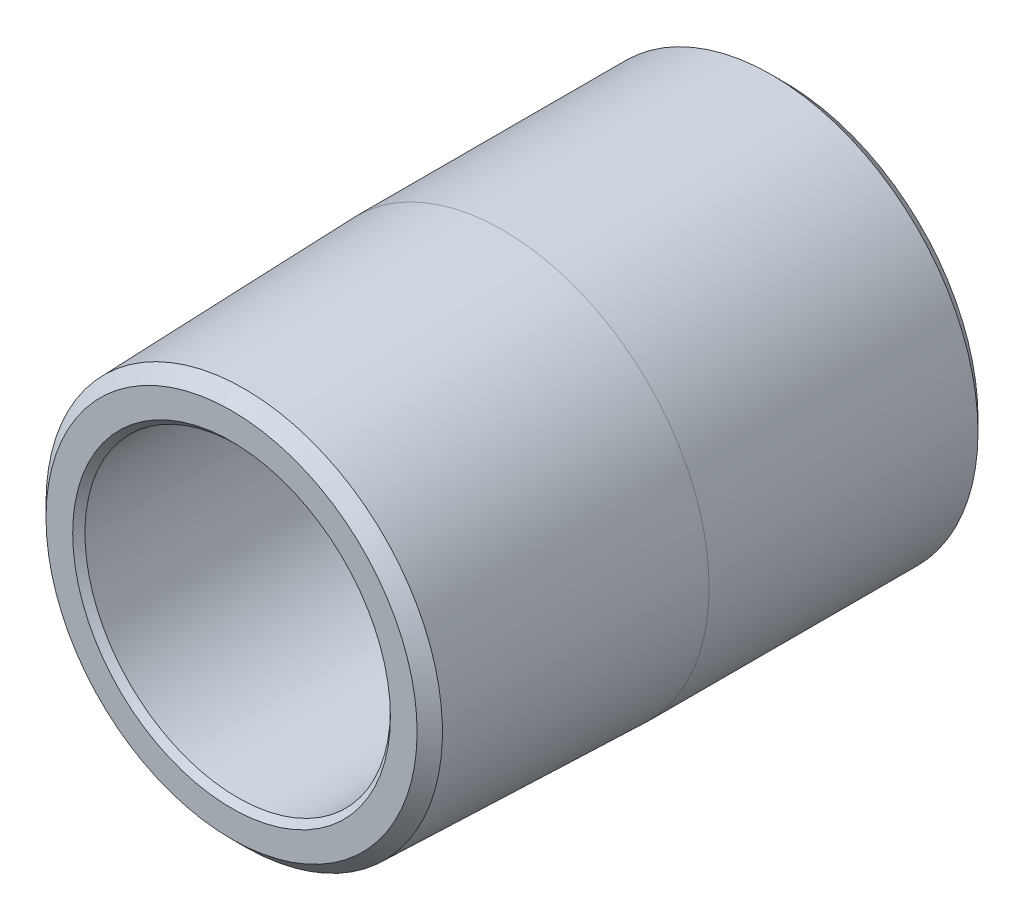
ISO-10303-21;
HEADER;
FILE_DESCRIPTION(('STEP AP214'),'2;1');
FILE_NAME('part.step','',(''),(''),'','','');
FILE_SCHEMA(('AUTOMOTIVE_DESIGN { 1 0 10303 214 1 1 1 1 }'));
ENDSEC;
DATA;
#1=APPLICATION_CONTEXT('core data for automotive mechanical design processes');
#2=APPLICATION_PROTOCOL_DEFINITION('international standard','automotive_design',2000,#1);
#3=PRODUCT_CONTEXT('',#1,'mechanical');
#4=PRODUCT('Part','Part','',(#3));
#5=PRODUCT_RELATED_PRODUCT_CATEGORY('part','',(#4));
#6=PRODUCT_DEFINITION_FORMATION('','',#4);
#7=PRODUCT_DEFINITION_CONTEXT('part definition',#1,'design');
#8=PRODUCT_DEFINITION('design','',#6,#7);
#9=PRODUCT_DEFINITION_SHAPE('','',#8);
#10=(LENGTH_UNIT() NAMED_UNIT(*) SI_UNIT(.MILLI.,.METRE.));
#11=(NAMED_UNIT(*) PLANE_ANGLE_UNIT() SI_UNIT($,.RADIAN.));
#12=(NAMED_UNIT(*) SI_UNIT($,.STERADIAN.) SOLID_ANGLE_UNIT());
#13=UNCERTAINTY_MEASURE_WITH_UNIT(LENGTH_MEASURE(1.E-05),#10,'distance_accuracy_value','');
#14=(GEOMETRIC_REPRESENTATION_CONTEXT(3) GLOBAL_UNCERTAINTY_ASSIGNED_CONTEXT((#13)) GLOBAL_UNIT_ASSIGNED_CONTEXT((#10,
#11,#12)) REPRESENTATION_CONTEXT('',''));
#15=CARTESIAN_POINT('',(0.,0.,0.));
#16=DIRECTION('',(0.,0.,1.));
#17=DIRECTION('',(1.,0.,0.));
#18=AXIS2_PLACEMENT_3D('',#15,#16,#17);
#19=CARTESIAN_POINT('',(8.88178419700125E-13,0.,28.575));
#20=DIRECTION('',(0.,0.,1.));
#21=DIRECTION('',(1.,0.,0.));
#22=AXIS2_PLACEMENT_3D('',#19,#20,#21);
#23=PLANE('',#22);
#24=CARTESIAN_POINT('',(8.88178419700125E-13,0.,28.575));
#25=DIRECTION('',(0.,0.,1.));
#26=DIRECTION('',(1.,0.,0.));
#27=AXIS2_PLACEMENT_3D('',#24,#25,#26);
#28=CIRCLE('',#27,8.21690000000001);
#29=CARTESIAN_POINT('',(8.21690000000092,0.,28.575));
#30=VERTEX_POINT('',#29);
#31=EDGE_CURVE('E41',#30,#30,#28,.F.);
#32=ORIENTED_EDGE('',*,*,#31,.T.);
#33=EDGE_LOOP('',(#32));
#34=FACE_BOUND('',#33,.T.);
#35=CARTESIAN_POINT('',(8.88178419700125E-13,0.,28.575));
#36=DIRECTION('',(0.,0.,1.));
#37=DIRECTION('',(1.,0.,0.));
#38=AXIS2_PLACEMENT_3D('',#35,#36,#37);
#39=CIRCLE('',#38,9.59688289542467);
#40=CARTESIAN_POINT('',(9.59688289542558,0.,28.575));
#41=VERTEX_POINT('',#40);
#42=EDGE_CURVE('E54',#41,#41,#39,.T.);
#43=ORIENTED_EDGE('',*,*,#42,.T.);
#44=EDGE_LOOP('',(#43));
#45=FACE_BOUND('',#44,.T.);
#46=ADVANCED_FACE('F34',(#34,#45),#23,.T.);
#47=CARTESIAN_POINT('',(0.,0.,0.));
#48=DIRECTION('',(0.,0.,1.));
#49=DIRECTION('',(1.,0.,0.));
#50=AXIS2_PLACEMENT_3D('',#47,#48,#49);
#51=PLANE('',#50);
#52=CARTESIAN_POINT('',(0.,0.,0.));
#53=DIRECTION('',(0.,0.,1.));
#54=DIRECTION('',(1.,0.,0.));
#55=AXIS2_PLACEMENT_3D('',#52,#53,#54);
#56=CIRCLE('',#55,8.21689999999999);
#57=CARTESIAN_POINT('',(8.21690000000001,0.,0.));
#58=VERTEX_POINT('',#57);
#59=EDGE_CURVE('E10',#58,#58,#56,.T.);
#60=ORIENTED_EDGE('',*,*,#59,.T.);
#61=EDGE_LOOP('',(#60));
#62=FACE_BOUND('',#61,.T.);
#63=CARTESIAN_POINT('',(0.,0.,0.));
#64=DIRECTION('',(0.,0.,1.));
#65=DIRECTION('',(1.,0.,0.));
#66=AXIS2_PLACEMENT_3D('',#63,#64,#65);
#67=CIRCLE('',#66,10.033);
#68=CARTESIAN_POINT('',(10.033,0.,0.));
#69=VERTEX_POINT('',#68);
#70=EDGE_CURVE('E60',#69,#69,#67,.F.);
#71=ORIENTED_EDGE('',*,*,#70,.T.);
#72=EDGE_LOOP('',(#71));
#73=FACE_BOUND('',#72,.T.);
#74=ADVANCED_FACE('F88',(#62,#73),#51,.F.);
#75=CARTESIAN_POINT('',(8.88178419700125E-13,0.,28.575));
#76=DIRECTION('',(0.,0.,-1.));
#77=DIRECTION('',(-1.,0.,0.));
#78=AXIS2_PLACEMENT_3D('',#75,#76,#77);
#79=CYLINDRICAL_SURFACE('',#78,10.668);
#80=CARTESIAN_POINT('',(0.,0.,0.635000000000052));
#81=DIRECTION('',(0.,0.,1.));
#82=DIRECTION('',(1.,0.,0.));
#83=AXIS2_PLACEMENT_3D('',#80,#81,#82);
#84=CIRCLE('',#83,10.668);
#85=CARTESIAN_POINT('',(10.668,0.,0.635000000000052));
#86=VERTEX_POINT('',#85);
#87=EDGE_CURVE('E63',#86,#86,#84,.T.);
#88=ORIENTED_EDGE('',*,*,#87,.T.);
#89=EDGE_LOOP('',(#88));
#90=FACE_BOUND('',#89,.T.);
#91=CARTESIAN_POINT('',(4.44089209850063E-13,0.,14.5415));
#92=DIRECTION('',(0.,0.,-1.));
#93=DIRECTION('',(-1.,0.,0.));
#94=AXIS2_PLACEMENT_3D('',#91,#92,#93);
#95=CIRCLE('',#94,10.668);
#96=CARTESIAN_POINT('',(-10.6679999999996,0.,14.5415));
#97=VERTEX_POINT('',#96);
#98=EDGE_CURVE('E66',#97,#97,#95,.T.);
#99=ORIENTED_EDGE('',*,*,#98,.T.);
#100=EDGE_LOOP('',(#99));
#101=FACE_BOUND('',#100,.T.);
#102=ADVANCED_FACE('F70',(#90,#101),#79,.T.);
#103=CARTESIAN_POINT('',(8.88178419700125E-13,0.,28.575));
#104=DIRECTION('',(0.,0.,-1.));
#105=DIRECTION('',(-1.,0.,0.));
#106=AXIS2_PLACEMENT_3D('',#103,#104,#105);
#107=CYLINDRICAL_SURFACE('',#106,7.8994);
#108=CARTESIAN_POINT('',(8.88178419700125E-13,0.,28.2575));
#109=DIRECTION('',(0.,0.,1.));
#110=DIRECTION('',(1.,0.,0.));
#111=AXIS2_PLACEMENT_3D('',#108,#109,#110);
#112=CIRCLE('',#111,7.8994);
#113=CARTESIAN_POINT('',(7.89940000000091,0.,28.2575));
#114=VERTEX_POINT('',#113);
#115=EDGE_CURVE('E45',#114,#114,#112,.T.);
#116=ORIENTED_EDGE('',*,*,#115,.T.);
#117=EDGE_LOOP('',(#116));
#118=FACE_BOUND('',#117,.T.);
#119=CARTESIAN_POINT('',(0.,0.,0.317499999999971));
#120=DIRECTION('',(0.,0.,1.));
#121=DIRECTION('',(1.,0.,0.));
#122=AXIS2_PLACEMENT_3D('',#119,#120,#121);
#123=CIRCLE('',#122,7.8994);
#124=CARTESIAN_POINT('',(7.89940000000002,0.,0.317499999999971));
#125=VERTEX_POINT('',#124);
#126=EDGE_CURVE('E49',#125,#125,#123,.F.);
#127=ORIENTED_EDGE('',*,*,#126,.T.);
#128=EDGE_LOOP('',(#127));
#129=FACE_BOUND('',#128,.T.);
#130=ADVANCED_FACE('F75',(#118,#129),#107,.F.);
#131=CARTESIAN_POINT('',(8.88178419700125E-13,0.,28.575));
#132=DIRECTION('',(0.,0.,-1.));
#133=DIRECTION('',(-1.,0.,0.));
#134=AXIS2_PLACEMENT_3D('',#131,#132,#133);
#135=CONICAL_SURFACE('',#134,10.2318828954247,0.0310668606854926);
#136=CARTESIAN_POINT('',(8.88178419700125E-13,0.,27.919633260052));
#137=DIRECTION('',(0.,0.,-1.));
#138=DIRECTION('',(-1.,0.,0.));
#139=AXIS2_PLACEMENT_3D('',#136,#137,#138);
#140=CIRCLE('',#139,10.2522496353727);
#141=CARTESIAN_POINT('',(-10.2522496353719,0.,27.919633260052));
#142=VERTEX_POINT('',#141);
#143=EDGE_CURVE('E57',#142,#142,#140,.T.);
#144=ORIENTED_EDGE('',*,*,#143,.T.);
#145=EDGE_LOOP('',(#144));
#146=FACE_BOUND('',#145,.T.);
#147=ORIENTED_EDGE('',*,*,#98,.F.);
#148=EDGE_LOOP('',(#147));
#149=FACE_BOUND('',#148,.T.);
#150=ADVANCED_FACE('F72',(#146,#149),#135,.T.);
#151=CARTESIAN_POINT('',(0.,0.,0.635000000000052));
#152=DIRECTION('',(0.,0.,1.));
#153=DIRECTION('',(1.,0.,0.));
#154=AXIS2_PLACEMENT_3D('',#151,#152,#153);
#155=CONICAL_SURFACE('',#154,10.668,0.78539816339745);
#156=ORIENTED_EDGE('',*,*,#70,.F.);
#157=EDGE_LOOP('',(#156));
#158=FACE_BOUND('',#157,.T.);
#159=ORIENTED_EDGE('',*,*,#87,.F.);
#160=EDGE_LOOP('',(#159));
#161=FACE_BOUND('',#160,.T.);
#162=ADVANCED_FACE('F74',(#158,#161),#155,.T.);
#163=CARTESIAN_POINT('',(8.88178419700125E-13,0.,27.919633260052));
#164=DIRECTION('',(0.,0.,-1.));
#165=DIRECTION('',(-1.,0.,0.));
#166=AXIS2_PLACEMENT_3D('',#163,#164,#165);
#167=CONICAL_SURFACE('',#166,10.2522496353727,0.785398163397452);
#168=ORIENTED_EDGE('',*,*,#42,.F.);
#169=EDGE_LOOP('',(#168));
#170=FACE_BOUND('',#169,.T.);
#171=ORIENTED_EDGE('',*,*,#143,.F.);
#172=EDGE_LOOP('',(#171));
#173=FACE_BOUND('',#172,.T.);
#174=ADVANCED_FACE('F82',(#170,#173),#167,.T.);
#175=CARTESIAN_POINT('',(8.88178419700125E-13,0.,28.2575));
#176=DIRECTION('',(0.,0.,1.));
#177=DIRECTION('',(1.,0.,0.));
#178=AXIS2_PLACEMENT_3D('',#175,#176,#177);
#179=CONICAL_SURFACE('',#178,7.8994,0.785398163397451);
#180=ORIENTED_EDGE('',*,*,#31,.F.);
#181=EDGE_LOOP('',(#180));
#182=FACE_BOUND('',#181,.T.);
#183=ORIENTED_EDGE('',*,*,#115,.F.);
#184=EDGE_LOOP('',(#183));
#185=FACE_BOUND('',#184,.T.);
#186=ADVANCED_FACE('F100',(#182,#185),#179,.F.);
#187=CARTESIAN_POINT('',(0.,0.,0.));
#188=DIRECTION('',(0.,0.,-1.));
#189=DIRECTION('',(-1.,0.,0.));
#190=AXIS2_PLACEMENT_3D('',#187,#188,#189);
#191=CONICAL_SURFACE('',#190,8.21689999999999,0.785398163397435);
#192=ORIENTED_EDGE('',*,*,#126,.F.);
#193=EDGE_LOOP('',(#192));
#194=FACE_BOUND('',#193,.T.);
#195=ORIENTED_EDGE('',*,*,#59,.F.);
#196=EDGE_LOOP('',(#195));
#197=FACE_BOUND('',#196,.T.);
#198=ADVANCED_FACE('F36',(#194,#197),#191,.F.);
#199=CLOSED_SHELL('',(#46,#74,#102,#130,#150,#162,#174,#186,#198));
#200=MANIFOLD_SOLID_BREP('B2',#199);
#201=ADVANCED_BREP_SHAPE_REPRESENTATION('',(#18,#200),#14);
#202=SHAPE_DEFINITION_REPRESENTATION(#9,#201);
ENDSEC;
END-ISO-10303-21;
